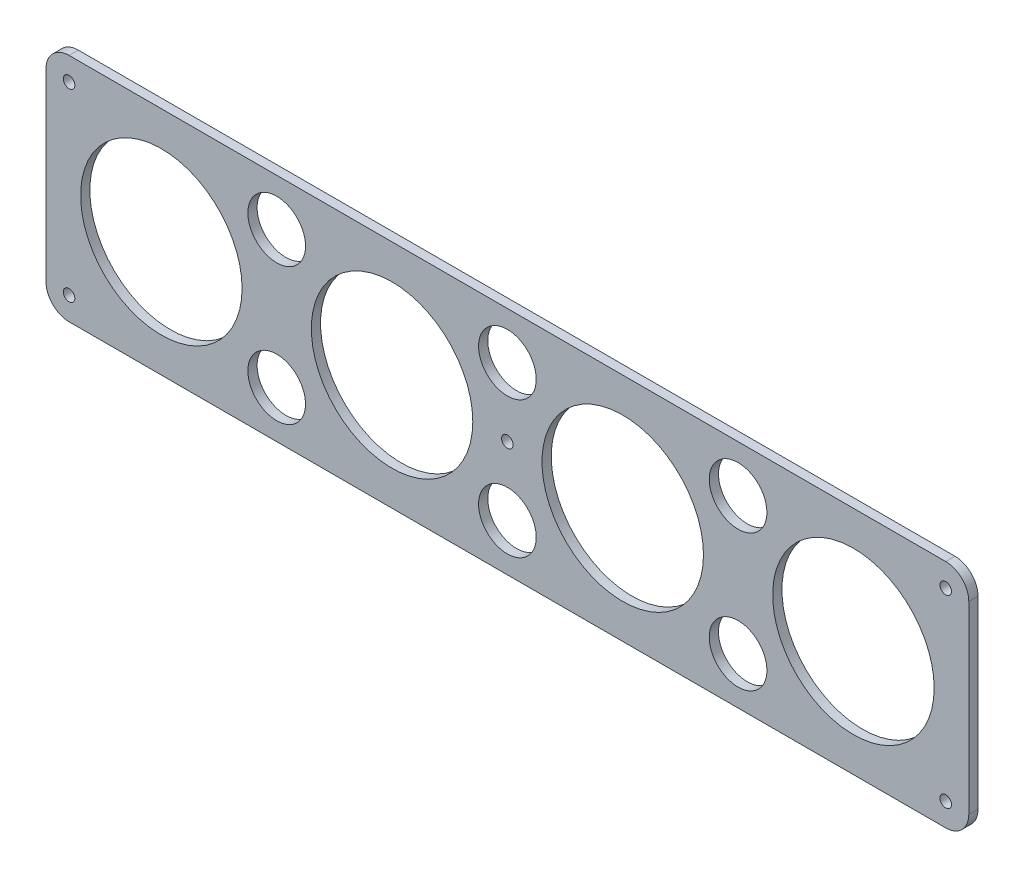
ISO-10303-21;
HEADER;
FILE_DESCRIPTION(('STEP AP214'),'2;1');
FILE_NAME('part.step','',(''),(''),'','','');
FILE_SCHEMA(('AUTOMOTIVE_DESIGN { 1 0 10303 214 1 1 1 1 }'));
ENDSEC;
DATA;
#1=APPLICATION_CONTEXT('core data for automotive mechanical design processes');
#2=APPLICATION_PROTOCOL_DEFINITION('international standard','automotive_design',2000,#1);
#3=PRODUCT_CONTEXT('',#1,'mechanical');
#4=PRODUCT('Part','Part','',(#3));
#5=PRODUCT_RELATED_PRODUCT_CATEGORY('part','',(#4));
#6=PRODUCT_DEFINITION_FORMATION('','',#4);
#7=PRODUCT_DEFINITION_CONTEXT('part definition',#1,'design');
#8=PRODUCT_DEFINITION('design','',#6,#7);
#9=PRODUCT_DEFINITION_SHAPE('','',#8);
#10=(LENGTH_UNIT() NAMED_UNIT(*) SI_UNIT(.MILLI.,.METRE.));
#11=(NAMED_UNIT(*) PLANE_ANGLE_UNIT() SI_UNIT($,.RADIAN.));
#12=(NAMED_UNIT(*) SI_UNIT($,.STERADIAN.) SOLID_ANGLE_UNIT());
#13=UNCERTAINTY_MEASURE_WITH_UNIT(LENGTH_MEASURE(1.E-05),#10,'distance_accuracy_value','');
#14=(GEOMETRIC_REPRESENTATION_CONTEXT(3) GLOBAL_UNCERTAINTY_ASSIGNED_CONTEXT((#13)) GLOBAL_UNIT_ASSIGNED_CONTEXT((#10,
#11,#12)) REPRESENTATION_CONTEXT('',''));
#15=CARTESIAN_POINT('',(0.,0.,0.));
#16=DIRECTION('',(0.,0.,1.));
#17=DIRECTION('',(1.,0.,0.));
#18=AXIS2_PLACEMENT_3D('',#15,#16,#17);
#19=CARTESIAN_POINT('',(0.,0.,4.));
#20=DIRECTION('',(0.,0.,-1.));
#21=DIRECTION('',(-1.,0.,0.));
#22=AXIS2_PLACEMENT_3D('',#19,#20,#21);
#23=PLANE('',#22);
#24=DIRECTION('',(0.,1.,0.));
#25=VECTOR('',#24,1.);
#26=CARTESIAN_POINT('',(400.,100.,4.));
#27=LINE('',#26,#25);
#28=CARTESIAN_POINT('',(400.,9.99999999999999,4.));
#29=VERTEX_POINT('',#28);
#30=CARTESIAN_POINT('',(400.,90.,4.));
#31=VERTEX_POINT('',#30);
#32=EDGE_CURVE('E171',#29,#31,#27,.T.);
#33=ORIENTED_EDGE('',*,*,#32,.T.);
#34=CARTESIAN_POINT('',(390.,90.,4.));
#35=DIRECTION('',(0.,0.,-1.));
#36=DIRECTION('',(-1.,0.,0.));
#37=AXIS2_PLACEMENT_3D('',#34,#35,#36);
#38=CIRCLE('',#37,10.);
#39=CARTESIAN_POINT('',(390.,100.,4.));
#40=VERTEX_POINT('',#39);
#41=EDGE_CURVE('E148',#31,#40,#38,.F.);
#42=ORIENTED_EDGE('',*,*,#41,.T.);
#43=DIRECTION('',(-1.,0.,0.));
#44=VECTOR('',#43,1.);
#45=CARTESIAN_POINT('',(0.,100.,4.));
#46=LINE('',#45,#44);
#47=CARTESIAN_POINT('',(10.,100.,4.));
#48=VERTEX_POINT('',#47);
#49=EDGE_CURVE('E119',#40,#48,#46,.T.);
#50=ORIENTED_EDGE('',*,*,#49,.T.);
#51=CARTESIAN_POINT('',(10.,90.,4.));
#52=DIRECTION('',(0.,0.,-1.));
#53=DIRECTION('',(-1.,0.,0.));
#54=AXIS2_PLACEMENT_3D('',#51,#52,#53);
#55=CIRCLE('',#54,10.);
#56=CARTESIAN_POINT('',(0.,90.,4.));
#57=VERTEX_POINT('',#56);
#58=EDGE_CURVE('E143',#48,#57,#55,.F.);
#59=ORIENTED_EDGE('',*,*,#58,.T.);
#60=DIRECTION('',(0.,-1.,0.));
#61=VECTOR('',#60,1.);
#62=CARTESIAN_POINT('',(0.,0.,4.));
#63=LINE('',#62,#61);
#64=CARTESIAN_POINT('',(0.,10.,4.));
#65=VERTEX_POINT('',#64);
#66=EDGE_CURVE('E126',#57,#65,#63,.T.);
#67=ORIENTED_EDGE('',*,*,#66,.T.);
#68=CARTESIAN_POINT('',(10.,10.,4.));
#69=DIRECTION('',(0.,0.,-1.));
#70=DIRECTION('',(-1.,0.,0.));
#71=AXIS2_PLACEMENT_3D('',#68,#69,#70);
#72=CIRCLE('',#71,10.);
#73=CARTESIAN_POINT('',(10.,0.,4.));
#74=VERTEX_POINT('',#73);
#75=EDGE_CURVE('E55',#65,#74,#72,.F.);
#76=ORIENTED_EDGE('',*,*,#75,.T.);
#77=DIRECTION('',(1.,0.,0.));
#78=VECTOR('',#77,1.);
#79=CARTESIAN_POINT('',(0.,0.,4.));
#80=LINE('',#79,#78);
#81=CARTESIAN_POINT('',(390.,0.,4.));
#82=VERTEX_POINT('',#81);
#83=EDGE_CURVE('E129',#74,#82,#80,.T.);
#84=ORIENTED_EDGE('',*,*,#83,.T.);
#85=CARTESIAN_POINT('',(390.,9.99999999999999,4.));
#86=DIRECTION('',(0.,0.,-1.));
#87=DIRECTION('',(-1.,0.,0.));
#88=AXIS2_PLACEMENT_3D('',#85,#86,#87);
#89=CIRCLE('',#88,10.);
#90=EDGE_CURVE('E146',#82,#29,#89,.F.);
#91=ORIENTED_EDGE('',*,*,#90,.T.);
#92=EDGE_LOOP('',(#33,#42,#50,#59,#67,#76,#84,#91));
#93=FACE_BOUND('',#92,.T.);
#94=CARTESIAN_POINT('',(50.,50.,4.));
#95=DIRECTION('',(0.,0.,1.));
#96=DIRECTION('',(1.,0.,0.));
#97=AXIS2_PLACEMENT_3D('',#94,#95,#96);
#98=CIRCLE('',#97,35.);
#99=CARTESIAN_POINT('',(85.,50.,4.));
#100=VERTEX_POINT('',#99);
#101=EDGE_CURVE('E164',#100,#100,#98,.T.);
#102=ORIENTED_EDGE('',*,*,#101,.F.);
#103=EDGE_LOOP('',(#102));
#104=FACE_BOUND('',#103,.T.);
#105=CARTESIAN_POINT('',(150.,50.,4.));
#106=DIRECTION('',(0.,0.,1.));
#107=DIRECTION('',(1.,0.,0.));
#108=AXIS2_PLACEMENT_3D('',#105,#106,#107);
#109=CIRCLE('',#108,35.);
#110=CARTESIAN_POINT('',(185.,50.,4.));
#111=VERTEX_POINT('',#110);
#112=EDGE_CURVE('E176',#111,#111,#109,.T.);
#113=ORIENTED_EDGE('',*,*,#112,.F.);
#114=EDGE_LOOP('',(#113));
#115=FACE_BOUND('',#114,.T.);
#116=CARTESIAN_POINT('',(250.,50.,4.));
#117=DIRECTION('',(0.,0.,1.));
#118=DIRECTION('',(1.,0.,0.));
#119=AXIS2_PLACEMENT_3D('',#116,#117,#118);
#120=CIRCLE('',#119,35.);
#121=CARTESIAN_POINT('',(285.,50.,4.));
#122=VERTEX_POINT('',#121);
#123=EDGE_CURVE('E181',#122,#122,#120,.T.);
#124=ORIENTED_EDGE('',*,*,#123,.F.);
#125=EDGE_LOOP('',(#124));
#126=FACE_BOUND('',#125,.T.);
#127=CARTESIAN_POINT('',(350.,50.,4.));
#128=DIRECTION('',(0.,0.,1.));
#129=DIRECTION('',(1.,0.,0.));
#130=AXIS2_PLACEMENT_3D('',#127,#128,#129);
#131=CIRCLE('',#130,35.);
#132=CARTESIAN_POINT('',(385.,50.,4.));
#133=VERTEX_POINT('',#132);
#134=EDGE_CURVE('E187',#133,#133,#131,.T.);
#135=ORIENTED_EDGE('',*,*,#134,.F.);
#136=EDGE_LOOP('',(#135));
#137=FACE_BOUND('',#136,.T.);
#138=CARTESIAN_POINT('',(100.,79.642297688561,4.));
#139=DIRECTION('',(0.,0.,1.));
#140=DIRECTION('',(1.,0.,0.));
#141=AXIS2_PLACEMENT_3D('',#138,#139,#140);
#142=CIRCLE('',#141,12.5);
#143=CARTESIAN_POINT('',(112.5,79.642297688561,4.));
#144=VERTEX_POINT('',#143);
#145=EDGE_CURVE('E193',#144,#144,#142,.T.);
#146=ORIENTED_EDGE('',*,*,#145,.F.);
#147=EDGE_LOOP('',(#146));
#148=FACE_BOUND('',#147,.T.);
#149=CARTESIAN_POINT('',(100.,20.357702311439,4.));
#150=DIRECTION('',(0.,0.,1.));
#151=DIRECTION('',(-1.,0.,0.));
#152=AXIS2_PLACEMENT_3D('',#149,#150,#151);
#153=CIRCLE('',#152,12.5);
#154=CARTESIAN_POINT('',(87.5,20.357702311439,4.));
#155=VERTEX_POINT('',#154);
#156=EDGE_CURVE('E199',#155,#155,#153,.T.);
#157=ORIENTED_EDGE('',*,*,#156,.F.);
#158=EDGE_LOOP('',(#157));
#159=FACE_BOUND('',#158,.T.);
#160=CARTESIAN_POINT('',(200.,79.642297688561,4.));
#161=DIRECTION('',(0.,0.,1.));
#162=DIRECTION('',(1.,0.,0.));
#163=AXIS2_PLACEMENT_3D('',#160,#161,#162);
#164=CIRCLE('',#163,12.5);
#165=CARTESIAN_POINT('',(212.5,79.642297688561,4.));
#166=VERTEX_POINT('',#165);
#167=EDGE_CURVE('E205',#166,#166,#164,.T.);
#168=ORIENTED_EDGE('',*,*,#167,.F.);
#169=EDGE_LOOP('',(#168));
#170=FACE_BOUND('',#169,.T.);
#171=CARTESIAN_POINT('',(200.,20.357702311439,4.));
#172=DIRECTION('',(0.,0.,1.));
#173=DIRECTION('',(-1.,0.,0.));
#174=AXIS2_PLACEMENT_3D('',#171,#172,#173);
#175=CIRCLE('',#174,12.5);
#176=CARTESIAN_POINT('',(187.5,20.357702311439,4.));
#177=VERTEX_POINT('',#176);
#178=EDGE_CURVE('E211',#177,#177,#175,.T.);
#179=ORIENTED_EDGE('',*,*,#178,.F.);
#180=EDGE_LOOP('',(#179));
#181=FACE_BOUND('',#180,.T.);
#182=CARTESIAN_POINT('',(300.,79.642297688561,4.));
#183=DIRECTION('',(0.,0.,1.));
#184=DIRECTION('',(1.,0.,0.));
#185=AXIS2_PLACEMENT_3D('',#182,#183,#184);
#186=CIRCLE('',#185,12.5);
#187=CARTESIAN_POINT('',(312.5,79.642297688561,4.));
#188=VERTEX_POINT('',#187);
#189=EDGE_CURVE('E217',#188,#188,#186,.T.);
#190=ORIENTED_EDGE('',*,*,#189,.F.);
#191=EDGE_LOOP('',(#190));
#192=FACE_BOUND('',#191,.T.);
#193=CARTESIAN_POINT('',(300.,20.357702311439,4.));
#194=DIRECTION('',(0.,0.,1.));
#195=DIRECTION('',(-1.,0.,0.));
#196=AXIS2_PLACEMENT_3D('',#193,#194,#195);
#197=CIRCLE('',#196,12.5);
#198=CARTESIAN_POINT('',(287.5,20.357702311439,4.));
#199=VERTEX_POINT('',#198);
#200=EDGE_CURVE('E223',#199,#199,#197,.T.);
#201=ORIENTED_EDGE('',*,*,#200,.F.);
#202=EDGE_LOOP('',(#201));
#203=FACE_BOUND('',#202,.T.);
#204=CARTESIAN_POINT('',(10.,10.,4.));
#205=DIRECTION('',(0.,0.,1.));
#206=DIRECTION('',(1.,0.,0.));
#207=AXIS2_PLACEMENT_3D('',#204,#205,#206);
#208=CIRCLE('',#207,2.5);
#209=CARTESIAN_POINT('',(12.5,10.,4.));
#210=VERTEX_POINT('',#209);
#211=EDGE_CURVE('E229',#210,#210,#208,.T.);
#212=ORIENTED_EDGE('',*,*,#211,.F.);
#213=EDGE_LOOP('',(#212));
#214=FACE_BOUND('',#213,.T.);
#215=CARTESIAN_POINT('',(10.,90.,4.));
#216=DIRECTION('',(0.,0.,1.));
#217=DIRECTION('',(-1.,0.,0.));
#218=AXIS2_PLACEMENT_3D('',#215,#216,#217);
#219=CIRCLE('',#218,2.5);
#220=CARTESIAN_POINT('',(7.50000000000001,90.,4.));
#221=VERTEX_POINT('',#220);
#222=EDGE_CURVE('E235',#221,#221,#219,.T.);
#223=ORIENTED_EDGE('',*,*,#222,.F.);
#224=EDGE_LOOP('',(#223));
#225=FACE_BOUND('',#224,.T.);
#226=CARTESIAN_POINT('',(390.,90.,4.));
#227=DIRECTION('',(0.,0.,1.));
#228=DIRECTION('',(1.,0.,0.));
#229=AXIS2_PLACEMENT_3D('',#226,#227,#228);
#230=CIRCLE('',#229,2.50000000000002);
#231=CARTESIAN_POINT('',(392.5,90.,4.));
#232=VERTEX_POINT('',#231);
#233=EDGE_CURVE('E241',#232,#232,#230,.T.);
#234=ORIENTED_EDGE('',*,*,#233,.F.);
#235=EDGE_LOOP('',(#234));
#236=FACE_BOUND('',#235,.T.);
#237=CARTESIAN_POINT('',(390.,10.,4.));
#238=DIRECTION('',(0.,0.,1.));
#239=DIRECTION('',(-1.,0.,0.));
#240=AXIS2_PLACEMENT_3D('',#237,#238,#239);
#241=CIRCLE('',#240,2.50000000000002);
#242=CARTESIAN_POINT('',(387.5,10.,4.));
#243=VERTEX_POINT('',#242);
#244=EDGE_CURVE('E247',#243,#243,#241,.T.);
#245=ORIENTED_EDGE('',*,*,#244,.F.);
#246=EDGE_LOOP('',(#245));
#247=FACE_BOUND('',#246,.T.);
#248=CARTESIAN_POINT('',(200.,50.,4.));
#249=DIRECTION('',(0.,0.,1.));
#250=DIRECTION('',(1.,0.,0.));
#251=AXIS2_PLACEMENT_3D('',#248,#249,#250);
#252=CIRCLE('',#251,2.5);
#253=CARTESIAN_POINT('',(202.5,50.,4.));
#254=VERTEX_POINT('',#253);
#255=EDGE_CURVE('E253',#254,#254,#252,.T.);
#256=ORIENTED_EDGE('',*,*,#255,.F.);
#257=EDGE_LOOP('',(#256));
#258=FACE_BOUND('',#257,.T.);
#259=ADVANCED_FACE('F33',(#93,#104,#115,#126,#137,#148,#159,#170,#181,#192,#203,#214,#225,#236,
#247,#258),#23,.F.);
#260=CARTESIAN_POINT('',(0.,0.,0.));
#261=DIRECTION('',(0.,0.,-1.));
#262=DIRECTION('',(-1.,0.,0.));
#263=AXIS2_PLACEMENT_3D('',#260,#261,#262);
#264=PLANE('',#263);
#265=CARTESIAN_POINT('',(390.,10.,0.));
#266=DIRECTION('',(0.,0.,1.));
#267=DIRECTION('',(-1.,0.,0.));
#268=AXIS2_PLACEMENT_3D('',#265,#266,#267);
#269=CIRCLE('',#268,2.50000000000002);
#270=CARTESIAN_POINT('',(387.5,10.,0.));
#271=VERTEX_POINT('',#270);
#272=EDGE_CURVE('E250',#271,#271,#269,.T.);
#273=ORIENTED_EDGE('',*,*,#272,.T.);
#274=EDGE_LOOP('',(#273));
#275=FACE_BOUND('',#274,.T.);
#276=CARTESIAN_POINT('',(10.,90.,0.));
#277=DIRECTION('',(0.,0.,1.));
#278=DIRECTION('',(-1.,0.,0.));
#279=AXIS2_PLACEMENT_3D('',#276,#277,#278);
#280=CIRCLE('',#279,2.5);
#281=CARTESIAN_POINT('',(7.50000000000001,90.,0.));
#282=VERTEX_POINT('',#281);
#283=EDGE_CURVE('E238',#282,#282,#280,.T.);
#284=ORIENTED_EDGE('',*,*,#283,.T.);
#285=EDGE_LOOP('',(#284));
#286=FACE_BOUND('',#285,.T.);
#287=CARTESIAN_POINT('',(300.,20.357702311439,0.));
#288=DIRECTION('',(0.,0.,1.));
#289=DIRECTION('',(-1.,0.,0.));
#290=AXIS2_PLACEMENT_3D('',#287,#288,#289);
#291=CIRCLE('',#290,12.5);
#292=CARTESIAN_POINT('',(287.5,20.357702311439,0.));
#293=VERTEX_POINT('',#292);
#294=EDGE_CURVE('E226',#293,#293,#291,.T.);
#295=ORIENTED_EDGE('',*,*,#294,.T.);
#296=EDGE_LOOP('',(#295));
#297=FACE_BOUND('',#296,.T.);
#298=CARTESIAN_POINT('',(200.,20.357702311439,0.));
#299=DIRECTION('',(0.,0.,1.));
#300=DIRECTION('',(-1.,0.,0.));
#301=AXIS2_PLACEMENT_3D('',#298,#299,#300);
#302=CIRCLE('',#301,12.5);
#303=CARTESIAN_POINT('',(187.5,20.357702311439,0.));
#304=VERTEX_POINT('',#303);
#305=EDGE_CURVE('E214',#304,#304,#302,.T.);
#306=ORIENTED_EDGE('',*,*,#305,.T.);
#307=EDGE_LOOP('',(#306));
#308=FACE_BOUND('',#307,.T.);
#309=CARTESIAN_POINT('',(100.,20.357702311439,0.));
#310=DIRECTION('',(0.,0.,1.));
#311=DIRECTION('',(-1.,0.,0.));
#312=AXIS2_PLACEMENT_3D('',#309,#310,#311);
#313=CIRCLE('',#312,12.5);
#314=CARTESIAN_POINT('',(87.5,20.357702311439,0.));
#315=VERTEX_POINT('',#314);
#316=EDGE_CURVE('E202',#315,#315,#313,.T.);
#317=ORIENTED_EDGE('',*,*,#316,.T.);
#318=EDGE_LOOP('',(#317));
#319=FACE_BOUND('',#318,.T.);
#320=CARTESIAN_POINT('',(350.,50.,0.));
#321=DIRECTION('',(0.,0.,1.));
#322=DIRECTION('',(1.,0.,0.));
#323=AXIS2_PLACEMENT_3D('',#320,#321,#322);
#324=CIRCLE('',#323,35.);
#325=CARTESIAN_POINT('',(385.,50.,0.));
#326=VERTEX_POINT('',#325);
#327=EDGE_CURVE('E190',#326,#326,#324,.T.);
#328=ORIENTED_EDGE('',*,*,#327,.T.);
#329=EDGE_LOOP('',(#328));
#330=FACE_BOUND('',#329,.T.);
#331=CARTESIAN_POINT('',(150.,50.,0.));
#332=DIRECTION('',(0.,0.,1.));
#333=DIRECTION('',(1.,0.,0.));
#334=AXIS2_PLACEMENT_3D('',#331,#332,#333);
#335=CIRCLE('',#334,35.);
#336=CARTESIAN_POINT('',(185.,50.,0.));
#337=VERTEX_POINT('',#336);
#338=EDGE_CURVE('E178',#337,#337,#335,.T.);
#339=ORIENTED_EDGE('',*,*,#338,.T.);
#340=EDGE_LOOP('',(#339));
#341=FACE_BOUND('',#340,.T.);
#342=DIRECTION('',(-1.,0.,0.));
#343=VECTOR('',#342,1.);
#344=CARTESIAN_POINT('',(0.,100.,0.));
#345=LINE('',#344,#343);
#346=CARTESIAN_POINT('',(390.,100.,0.));
#347=VERTEX_POINT('',#346);
#348=CARTESIAN_POINT('',(10.,100.,0.));
#349=VERTEX_POINT('',#348);
#350=EDGE_CURVE('E116',#347,#349,#345,.T.);
#351=ORIENTED_EDGE('',*,*,#350,.F.);
#352=CARTESIAN_POINT('',(390.,90.,0.));
#353=DIRECTION('',(0.,0.,-1.));
#354=DIRECTION('',(-1.,0.,0.));
#355=AXIS2_PLACEMENT_3D('',#352,#353,#354);
#356=CIRCLE('',#355,10.);
#357=CARTESIAN_POINT('',(400.,90.,0.));
#358=VERTEX_POINT('',#357);
#359=EDGE_CURVE('E99',#347,#358,#356,.T.);
#360=ORIENTED_EDGE('',*,*,#359,.T.);
#361=DIRECTION('',(0.,1.,0.));
#362=VECTOR('',#361,1.);
#363=CARTESIAN_POINT('',(400.,100.,0.));
#364=LINE('',#363,#362);
#365=CARTESIAN_POINT('',(400.,9.99999999999999,0.));
#366=VERTEX_POINT('',#365);
#367=EDGE_CURVE('E127',#366,#358,#364,.T.);
#368=ORIENTED_EDGE('',*,*,#367,.F.);
#369=CARTESIAN_POINT('',(390.,9.99999999999999,0.));
#370=DIRECTION('',(0.,0.,-1.));
#371=DIRECTION('',(-1.,0.,0.));
#372=AXIS2_PLACEMENT_3D('',#369,#370,#371);
#373=CIRCLE('',#372,10.);
#374=CARTESIAN_POINT('',(390.,0.,0.));
#375=VERTEX_POINT('',#374);
#376=EDGE_CURVE('E110',#366,#375,#373,.T.);
#377=ORIENTED_EDGE('',*,*,#376,.T.);
#378=DIRECTION('',(1.,0.,0.));
#379=VECTOR('',#378,1.);
#380=CARTESIAN_POINT('',(0.,0.,0.));
#381=LINE('',#380,#379);
#382=CARTESIAN_POINT('',(10.,0.,0.));
#383=VERTEX_POINT('',#382);
#384=EDGE_CURVE('E131',#383,#375,#381,.T.);
#385=ORIENTED_EDGE('',*,*,#384,.F.);
#386=CARTESIAN_POINT('',(10.,10.,0.));
#387=DIRECTION('',(0.,0.,-1.));
#388=DIRECTION('',(-1.,0.,0.));
#389=AXIS2_PLACEMENT_3D('',#386,#387,#388);
#390=CIRCLE('',#389,10.);
#391=CARTESIAN_POINT('',(0.,10.,0.));
#392=VERTEX_POINT('',#391);
#393=EDGE_CURVE('E137',#383,#392,#390,.T.);
#394=ORIENTED_EDGE('',*,*,#393,.T.);
#395=DIRECTION('',(0.,-1.,0.));
#396=VECTOR('',#395,1.);
#397=CARTESIAN_POINT('',(0.,0.,0.));
#398=LINE('',#397,#396);
#399=CARTESIAN_POINT('',(0.,90.,0.));
#400=VERTEX_POINT('',#399);
#401=EDGE_CURVE('E159',#400,#392,#398,.T.);
#402=ORIENTED_EDGE('',*,*,#401,.F.);
#403=CARTESIAN_POINT('',(10.,90.,0.));
#404=DIRECTION('',(0.,0.,-1.));
#405=DIRECTION('',(-1.,0.,0.));
#406=AXIS2_PLACEMENT_3D('',#403,#404,#405);
#407=CIRCLE('',#406,10.);
#408=EDGE_CURVE('E120',#400,#349,#407,.T.);
#409=ORIENTED_EDGE('',*,*,#408,.T.);
#410=EDGE_LOOP('',(#351,#360,#368,#377,#385,#394,#402,#409));
#411=FACE_BOUND('',#410,.T.);
#412=CARTESIAN_POINT('',(50.,50.,0.));
#413=DIRECTION('',(0.,0.,1.));
#414=DIRECTION('',(1.,0.,0.));
#415=AXIS2_PLACEMENT_3D('',#412,#413,#414);
#416=CIRCLE('',#415,35.);
#417=CARTESIAN_POINT('',(85.,50.,0.));
#418=VERTEX_POINT('',#417);
#419=EDGE_CURVE('E167',#418,#418,#416,.T.);
#420=ORIENTED_EDGE('',*,*,#419,.T.);
#421=EDGE_LOOP('',(#420));
#422=FACE_BOUND('',#421,.T.);
#423=CARTESIAN_POINT('',(250.,50.,0.));
#424=DIRECTION('',(0.,0.,1.));
#425=DIRECTION('',(1.,0.,0.));
#426=AXIS2_PLACEMENT_3D('',#423,#424,#425);
#427=CIRCLE('',#426,35.);
#428=CARTESIAN_POINT('',(285.,50.,0.));
#429=VERTEX_POINT('',#428);
#430=EDGE_CURVE('E184',#429,#429,#427,.T.);
#431=ORIENTED_EDGE('',*,*,#430,.T.);
#432=EDGE_LOOP('',(#431));
#433=FACE_BOUND('',#432,.T.);
#434=CARTESIAN_POINT('',(100.,79.642297688561,0.));
#435=DIRECTION('',(0.,0.,1.));
#436=DIRECTION('',(1.,0.,0.));
#437=AXIS2_PLACEMENT_3D('',#434,#435,#436);
#438=CIRCLE('',#437,12.5);
#439=CARTESIAN_POINT('',(112.5,79.642297688561,0.));
#440=VERTEX_POINT('',#439);
#441=EDGE_CURVE('E196',#440,#440,#438,.T.);
#442=ORIENTED_EDGE('',*,*,#441,.T.);
#443=EDGE_LOOP('',(#442));
#444=FACE_BOUND('',#443,.T.);
#445=CARTESIAN_POINT('',(200.,79.642297688561,0.));
#446=DIRECTION('',(0.,0.,1.));
#447=DIRECTION('',(1.,0.,0.));
#448=AXIS2_PLACEMENT_3D('',#445,#446,#447);
#449=CIRCLE('',#448,12.5);
#450=CARTESIAN_POINT('',(212.5,79.642297688561,0.));
#451=VERTEX_POINT('',#450);
#452=EDGE_CURVE('E208',#451,#451,#449,.T.);
#453=ORIENTED_EDGE('',*,*,#452,.T.);
#454=EDGE_LOOP('',(#453));
#455=FACE_BOUND('',#454,.T.);
#456=CARTESIAN_POINT('',(300.,79.642297688561,0.));
#457=DIRECTION('',(0.,0.,1.));
#458=DIRECTION('',(1.,0.,0.));
#459=AXIS2_PLACEMENT_3D('',#456,#457,#458);
#460=CIRCLE('',#459,12.5);
#461=CARTESIAN_POINT('',(312.5,79.642297688561,0.));
#462=VERTEX_POINT('',#461);
#463=EDGE_CURVE('E220',#462,#462,#460,.T.);
#464=ORIENTED_EDGE('',*,*,#463,.T.);
#465=EDGE_LOOP('',(#464));
#466=FACE_BOUND('',#465,.T.);
#467=CARTESIAN_POINT('',(10.,10.,0.));
#468=DIRECTION('',(0.,0.,1.));
#469=DIRECTION('',(1.,0.,0.));
#470=AXIS2_PLACEMENT_3D('',#467,#468,#469);
#471=CIRCLE('',#470,2.5);
#472=CARTESIAN_POINT('',(12.5,10.,0.));
#473=VERTEX_POINT('',#472);
#474=EDGE_CURVE('E232',#473,#473,#471,.T.);
#475=ORIENTED_EDGE('',*,*,#474,.T.);
#476=EDGE_LOOP('',(#475));
#477=FACE_BOUND('',#476,.T.);
#478=CARTESIAN_POINT('',(390.,90.,0.));
#479=DIRECTION('',(0.,0.,1.));
#480=DIRECTION('',(1.,0.,0.));
#481=AXIS2_PLACEMENT_3D('',#478,#479,#480);
#482=CIRCLE('',#481,2.50000000000002);
#483=CARTESIAN_POINT('',(392.5,90.,0.));
#484=VERTEX_POINT('',#483);
#485=EDGE_CURVE('E244',#484,#484,#482,.T.);
#486=ORIENTED_EDGE('',*,*,#485,.T.);
#487=EDGE_LOOP('',(#486));
#488=FACE_BOUND('',#487,.T.);
#489=CARTESIAN_POINT('',(200.,50.,0.));
#490=DIRECTION('',(0.,0.,1.));
#491=DIRECTION('',(1.,0.,0.));
#492=AXIS2_PLACEMENT_3D('',#489,#490,#491);
#493=CIRCLE('',#492,2.5);
#494=CARTESIAN_POINT('',(202.5,50.,0.));
#495=VERTEX_POINT('',#494);
#496=EDGE_CURVE('E256',#495,#495,#493,.T.);
#497=ORIENTED_EDGE('',*,*,#496,.T.);
#498=EDGE_LOOP('',(#497));
#499=FACE_BOUND('',#498,.T.);
#500=ADVANCED_FACE('F123',(#275,#286,#297,#308,#319,#330,#341,#411,#422,#433,#444,#455,#466,
#477,#488,#499),#264,.T.);
#501=CARTESIAN_POINT('',(0.,0.,4.));
#502=DIRECTION('',(1.,0.,0.));
#503=DIRECTION('',(0.,0.,-1.));
#504=AXIS2_PLACEMENT_3D('',#501,#502,#503);
#505=PLANE('',#504);
#506=ORIENTED_EDGE('',*,*,#401,.T.);
#507=DIRECTION('',(0.,0.,-1.));
#508=VECTOR('',#507,1.);
#509=CARTESIAN_POINT('',(0.,10.,4.));
#510=LINE('',#509,#508);
#511=EDGE_CURVE('E11',#392,#65,#510,.F.);
#512=ORIENTED_EDGE('',*,*,#511,.T.);
#513=ORIENTED_EDGE('',*,*,#66,.F.);
#514=DIRECTION('',(0.,0.,-1.));
#515=VECTOR('',#514,1.);
#516=CARTESIAN_POINT('',(0.,90.,4.));
#517=LINE('',#516,#515);
#518=EDGE_CURVE('E41',#57,#400,#517,.T.);
#519=ORIENTED_EDGE('',*,*,#518,.T.);
#520=EDGE_LOOP('',(#506,#512,#513,#519));
#521=FACE_BOUND('',#520,.T.);
#522=ADVANCED_FACE('F158',(#521),#505,.F.);
#523=CARTESIAN_POINT('',(0.,0.,4.));
#524=DIRECTION('',(0.,1.,0.));
#525=DIRECTION('',(0.,0.,1.));
#526=AXIS2_PLACEMENT_3D('',#523,#524,#525);
#527=PLANE('',#526);
#528=ORIENTED_EDGE('',*,*,#384,.T.);
#529=DIRECTION('',(0.,0.,-1.));
#530=VECTOR('',#529,1.);
#531=CARTESIAN_POINT('',(390.,0.,4.));
#532=LINE('',#531,#530);
#533=EDGE_CURVE('E48',#375,#82,#532,.F.);
#534=ORIENTED_EDGE('',*,*,#533,.T.);
#535=ORIENTED_EDGE('',*,*,#83,.F.);
#536=DIRECTION('',(0.,0.,-1.));
#537=VECTOR('',#536,1.);
#538=CARTESIAN_POINT('',(10.,0.,4.));
#539=LINE('',#538,#537);
#540=EDGE_CURVE('E150',#74,#383,#539,.T.);
#541=ORIENTED_EDGE('',*,*,#540,.T.);
#542=EDGE_LOOP('',(#528,#534,#535,#541));
#543=FACE_BOUND('',#542,.T.);
#544=ADVANCED_FACE('F282',(#543),#527,.F.);
#545=CARTESIAN_POINT('',(400.,100.,4.));
#546=DIRECTION('',(-1.,0.,0.));
#547=DIRECTION('',(0.,0.,1.));
#548=AXIS2_PLACEMENT_3D('',#545,#546,#547);
#549=PLANE('',#548);
#550=ORIENTED_EDGE('',*,*,#367,.T.);
#551=DIRECTION('',(0.,0.,-1.));
#552=VECTOR('',#551,1.);
#553=CARTESIAN_POINT('',(400.,90.,4.));
#554=LINE('',#553,#552);
#555=EDGE_CURVE('E104',#358,#31,#554,.F.);
#556=ORIENTED_EDGE('',*,*,#555,.T.);
#557=ORIENTED_EDGE('',*,*,#32,.F.);
#558=DIRECTION('',(0.,0.,-1.));
#559=VECTOR('',#558,1.);
#560=CARTESIAN_POINT('',(400.,9.99999999999999,4.));
#561=LINE('',#560,#559);
#562=EDGE_CURVE('E109',#29,#366,#561,.T.);
#563=ORIENTED_EDGE('',*,*,#562,.T.);
#564=EDGE_LOOP('',(#550,#556,#557,#563));
#565=FACE_BOUND('',#564,.T.);
#566=ADVANCED_FACE('F279',(#565),#549,.F.);
#567=CARTESIAN_POINT('',(0.,100.,4.));
#568=DIRECTION('',(0.,-1.,0.));
#569=DIRECTION('',(0.,0.,-1.));
#570=AXIS2_PLACEMENT_3D('',#567,#568,#569);
#571=PLANE('',#570);
#572=ORIENTED_EDGE('',*,*,#49,.F.);
#573=DIRECTION('',(0.,0.,-1.));
#574=VECTOR('',#573,1.);
#575=CARTESIAN_POINT('',(390.,100.,4.));
#576=LINE('',#575,#574);
#577=EDGE_CURVE('E103',#40,#347,#576,.T.);
#578=ORIENTED_EDGE('',*,*,#577,.T.);
#579=ORIENTED_EDGE('',*,*,#350,.T.);
#580=DIRECTION('',(0.,0.,-1.));
#581=VECTOR('',#580,1.);
#582=CARTESIAN_POINT('',(10.,100.,4.));
#583=LINE('',#582,#581);
#584=EDGE_CURVE('E121',#349,#48,#583,.F.);
#585=ORIENTED_EDGE('',*,*,#584,.T.);
#586=EDGE_LOOP('',(#572,#578,#579,#585));
#587=FACE_BOUND('',#586,.T.);
#588=ADVANCED_FACE('F115',(#587),#571,.F.);
#589=CARTESIAN_POINT('',(50.,50.,4.));
#590=DIRECTION('',(0.,0.,-1.));
#591=DIRECTION('',(-1.,0.,0.));
#592=AXIS2_PLACEMENT_3D('',#589,#590,#591);
#593=CYLINDRICAL_SURFACE('',#592,35.);
#594=ORIENTED_EDGE('',*,*,#101,.T.);
#595=EDGE_LOOP('',(#594));
#596=FACE_BOUND('',#595,.T.);
#597=ORIENTED_EDGE('',*,*,#419,.F.);
#598=EDGE_LOOP('',(#597));
#599=FACE_BOUND('',#598,.T.);
#600=ADVANCED_FACE('F274',(#596,#599),#593,.F.);
#601=CARTESIAN_POINT('',(150.,50.,4.));
#602=DIRECTION('',(0.,0.,-1.));
#603=DIRECTION('',(-1.,0.,0.));
#604=AXIS2_PLACEMENT_3D('',#601,#602,#603);
#605=CYLINDRICAL_SURFACE('',#604,35.);
#606=ORIENTED_EDGE('',*,*,#112,.T.);
#607=EDGE_LOOP('',(#606));
#608=FACE_BOUND('',#607,.T.);
#609=ORIENTED_EDGE('',*,*,#338,.F.);
#610=EDGE_LOOP('',(#609));
#611=FACE_BOUND('',#610,.T.);
#612=ADVANCED_FACE('F485',(#608,#611),#605,.F.);
#613=CARTESIAN_POINT('',(250.,50.,4.));
#614=DIRECTION('',(0.,0.,-1.));
#615=DIRECTION('',(-1.,0.,0.));
#616=AXIS2_PLACEMENT_3D('',#613,#614,#615);
#617=CYLINDRICAL_SURFACE('',#616,35.);
#618=ORIENTED_EDGE('',*,*,#123,.T.);
#619=EDGE_LOOP('',(#618));
#620=FACE_BOUND('',#619,.T.);
#621=ORIENTED_EDGE('',*,*,#430,.F.);
#622=EDGE_LOOP('',(#621));
#623=FACE_BOUND('',#622,.T.);
#624=ADVANCED_FACE('F475',(#620,#623),#617,.F.);
#625=CARTESIAN_POINT('',(350.,50.,4.));
#626=DIRECTION('',(0.,0.,-1.));
#627=DIRECTION('',(-1.,0.,0.));
#628=AXIS2_PLACEMENT_3D('',#625,#626,#627);
#629=CYLINDRICAL_SURFACE('',#628,35.);
#630=ORIENTED_EDGE('',*,*,#134,.T.);
#631=EDGE_LOOP('',(#630));
#632=FACE_BOUND('',#631,.T.);
#633=ORIENTED_EDGE('',*,*,#327,.F.);
#634=EDGE_LOOP('',(#633));
#635=FACE_BOUND('',#634,.T.);
#636=ADVANCED_FACE('F465',(#632,#635),#629,.F.);
#637=CARTESIAN_POINT('',(100.,79.642297688561,4.));
#638=DIRECTION('',(0.,0.,-1.));
#639=DIRECTION('',(-1.,0.,0.));
#640=AXIS2_PLACEMENT_3D('',#637,#638,#639);
#641=CYLINDRICAL_SURFACE('',#640,12.5);
#642=ORIENTED_EDGE('',*,*,#145,.T.);
#643=EDGE_LOOP('',(#642));
#644=FACE_BOUND('',#643,.T.);
#645=ORIENTED_EDGE('',*,*,#441,.F.);
#646=EDGE_LOOP('',(#645));
#647=FACE_BOUND('',#646,.T.);
#648=ADVANCED_FACE('F455',(#644,#647),#641,.F.);
#649=CARTESIAN_POINT('',(100.,20.357702311439,4.));
#650=DIRECTION('',(0.,0.,-1.));
#651=DIRECTION('',(-1.,0.,0.));
#652=AXIS2_PLACEMENT_3D('',#649,#650,#651);
#653=CYLINDRICAL_SURFACE('',#652,12.5);
#654=ORIENTED_EDGE('',*,*,#156,.T.);
#655=EDGE_LOOP('',(#654));
#656=FACE_BOUND('',#655,.T.);
#657=ORIENTED_EDGE('',*,*,#316,.F.);
#658=EDGE_LOOP('',(#657));
#659=FACE_BOUND('',#658,.T.);
#660=ADVANCED_FACE('F445',(#656,#659),#653,.F.);
#661=CARTESIAN_POINT('',(200.,79.642297688561,4.));
#662=DIRECTION('',(0.,0.,-1.));
#663=DIRECTION('',(-1.,0.,0.));
#664=AXIS2_PLACEMENT_3D('',#661,#662,#663);
#665=CYLINDRICAL_SURFACE('',#664,12.5);
#666=ORIENTED_EDGE('',*,*,#167,.T.);
#667=EDGE_LOOP('',(#666));
#668=FACE_BOUND('',#667,.T.);
#669=ORIENTED_EDGE('',*,*,#452,.F.);
#670=EDGE_LOOP('',(#669));
#671=FACE_BOUND('',#670,.T.);
#672=ADVANCED_FACE('F435',(#668,#671),#665,.F.);
#673=CARTESIAN_POINT('',(200.,20.357702311439,4.));
#674=DIRECTION('',(0.,0.,-1.));
#675=DIRECTION('',(-1.,0.,0.));
#676=AXIS2_PLACEMENT_3D('',#673,#674,#675);
#677=CYLINDRICAL_SURFACE('',#676,12.5);
#678=ORIENTED_EDGE('',*,*,#178,.T.);
#679=EDGE_LOOP('',(#678));
#680=FACE_BOUND('',#679,.T.);
#681=ORIENTED_EDGE('',*,*,#305,.F.);
#682=EDGE_LOOP('',(#681));
#683=FACE_BOUND('',#682,.T.);
#684=ADVANCED_FACE('F425',(#680,#683),#677,.F.);
#685=CARTESIAN_POINT('',(300.,79.642297688561,4.));
#686=DIRECTION('',(0.,0.,-1.));
#687=DIRECTION('',(-1.,0.,0.));
#688=AXIS2_PLACEMENT_3D('',#685,#686,#687);
#689=CYLINDRICAL_SURFACE('',#688,12.5);
#690=ORIENTED_EDGE('',*,*,#189,.T.);
#691=EDGE_LOOP('',(#690));
#692=FACE_BOUND('',#691,.T.);
#693=ORIENTED_EDGE('',*,*,#463,.F.);
#694=EDGE_LOOP('',(#693));
#695=FACE_BOUND('',#694,.T.);
#696=ADVANCED_FACE('F415',(#692,#695),#689,.F.);
#697=CARTESIAN_POINT('',(300.,20.357702311439,4.));
#698=DIRECTION('',(0.,0.,-1.));
#699=DIRECTION('',(-1.,0.,0.));
#700=AXIS2_PLACEMENT_3D('',#697,#698,#699);
#701=CYLINDRICAL_SURFACE('',#700,12.5);
#702=ORIENTED_EDGE('',*,*,#200,.T.);
#703=EDGE_LOOP('',(#702));
#704=FACE_BOUND('',#703,.T.);
#705=ORIENTED_EDGE('',*,*,#294,.F.);
#706=EDGE_LOOP('',(#705));
#707=FACE_BOUND('',#706,.T.);
#708=ADVANCED_FACE('F405',(#704,#707),#701,.F.);
#709=CARTESIAN_POINT('',(10.,10.,4.));
#710=DIRECTION('',(0.,0.,-1.));
#711=DIRECTION('',(-1.,0.,0.));
#712=AXIS2_PLACEMENT_3D('',#709,#710,#711);
#713=CYLINDRICAL_SURFACE('',#712,2.5);
#714=ORIENTED_EDGE('',*,*,#211,.T.);
#715=EDGE_LOOP('',(#714));
#716=FACE_BOUND('',#715,.T.);
#717=ORIENTED_EDGE('',*,*,#474,.F.);
#718=EDGE_LOOP('',(#717));
#719=FACE_BOUND('',#718,.T.);
#720=ADVANCED_FACE('F395',(#716,#719),#713,.F.);
#721=CARTESIAN_POINT('',(10.,90.,4.));
#722=DIRECTION('',(0.,0.,-1.));
#723=DIRECTION('',(-1.,0.,0.));
#724=AXIS2_PLACEMENT_3D('',#721,#722,#723);
#725=CYLINDRICAL_SURFACE('',#724,2.5);
#726=ORIENTED_EDGE('',*,*,#222,.T.);
#727=EDGE_LOOP('',(#726));
#728=FACE_BOUND('',#727,.T.);
#729=ORIENTED_EDGE('',*,*,#283,.F.);
#730=EDGE_LOOP('',(#729));
#731=FACE_BOUND('',#730,.T.);
#732=ADVANCED_FACE('F385',(#728,#731),#725,.F.);
#733=CARTESIAN_POINT('',(390.,90.,4.));
#734=DIRECTION('',(0.,0.,-1.));
#735=DIRECTION('',(-1.,0.,0.));
#736=AXIS2_PLACEMENT_3D('',#733,#734,#735);
#737=CYLINDRICAL_SURFACE('',#736,2.50000000000002);
#738=ORIENTED_EDGE('',*,*,#233,.T.);
#739=EDGE_LOOP('',(#738));
#740=FACE_BOUND('',#739,.T.);
#741=ORIENTED_EDGE('',*,*,#485,.F.);
#742=EDGE_LOOP('',(#741));
#743=FACE_BOUND('',#742,.T.);
#744=ADVANCED_FACE('F375',(#740,#743),#737,.F.);
#745=CARTESIAN_POINT('',(390.,10.,4.));
#746=DIRECTION('',(0.,0.,-1.));
#747=DIRECTION('',(-1.,0.,0.));
#748=AXIS2_PLACEMENT_3D('',#745,#746,#747);
#749=CYLINDRICAL_SURFACE('',#748,2.50000000000002);
#750=ORIENTED_EDGE('',*,*,#244,.T.);
#751=EDGE_LOOP('',(#750));
#752=FACE_BOUND('',#751,.T.);
#753=ORIENTED_EDGE('',*,*,#272,.F.);
#754=EDGE_LOOP('',(#753));
#755=FACE_BOUND('',#754,.T.);
#756=ADVANCED_FACE('F366',(#752,#755),#749,.F.);
#757=CARTESIAN_POINT('',(200.,50.,4.));
#758=DIRECTION('',(0.,0.,-1.));
#759=DIRECTION('',(-1.,0.,0.));
#760=AXIS2_PLACEMENT_3D('',#757,#758,#759);
#761=CYLINDRICAL_SURFACE('',#760,2.5);
#762=ORIENTED_EDGE('',*,*,#255,.T.);
#763=EDGE_LOOP('',(#762));
#764=FACE_BOUND('',#763,.T.);
#765=ORIENTED_EDGE('',*,*,#496,.F.);
#766=EDGE_LOOP('',(#765));
#767=FACE_BOUND('',#766,.T.);
#768=ADVANCED_FACE('F262',(#764,#767),#761,.F.);
#769=CARTESIAN_POINT('',(390.,90.,4.));
#770=DIRECTION('',(0.,0.,-1.));
#771=DIRECTION('',(-1.,0.,0.));
#772=AXIS2_PLACEMENT_3D('',#769,#770,#771);
#773=CYLINDRICAL_SURFACE('',#772,10.);
#774=ORIENTED_EDGE('',*,*,#41,.F.);
#775=ORIENTED_EDGE('',*,*,#555,.F.);
#776=ORIENTED_EDGE('',*,*,#359,.F.);
#777=ORIENTED_EDGE('',*,*,#577,.F.);
#778=EDGE_LOOP('',(#774,#775,#776,#777));
#779=FACE_BOUND('',#778,.T.);
#780=ADVANCED_FACE('F102',(#779),#773,.T.);
#781=CARTESIAN_POINT('',(390.,9.99999999999999,4.));
#782=DIRECTION('',(0.,0.,-1.));
#783=DIRECTION('',(-1.,0.,0.));
#784=AXIS2_PLACEMENT_3D('',#781,#782,#783);
#785=CYLINDRICAL_SURFACE('',#784,10.);
#786=ORIENTED_EDGE('',*,*,#90,.F.);
#787=ORIENTED_EDGE('',*,*,#533,.F.);
#788=ORIENTED_EDGE('',*,*,#376,.F.);
#789=ORIENTED_EDGE('',*,*,#562,.F.);
#790=EDGE_LOOP('',(#786,#787,#788,#789));
#791=FACE_BOUND('',#790,.T.);
#792=ADVANCED_FACE('F290',(#791),#785,.T.);
#793=CARTESIAN_POINT('',(10.,10.,4.));
#794=DIRECTION('',(0.,0.,-1.));
#795=DIRECTION('',(-1.,0.,0.));
#796=AXIS2_PLACEMENT_3D('',#793,#794,#795);
#797=CYLINDRICAL_SURFACE('',#796,10.);
#798=ORIENTED_EDGE('',*,*,#75,.F.);
#799=ORIENTED_EDGE('',*,*,#511,.F.);
#800=ORIENTED_EDGE('',*,*,#393,.F.);
#801=ORIENTED_EDGE('',*,*,#540,.F.);
#802=EDGE_LOOP('',(#798,#799,#800,#801));
#803=FACE_BOUND('',#802,.T.);
#804=ADVANCED_FACE('F292',(#803),#797,.T.);
#805=CARTESIAN_POINT('',(10.,90.,4.));
#806=DIRECTION('',(0.,0.,-1.));
#807=DIRECTION('',(-1.,0.,0.));
#808=AXIS2_PLACEMENT_3D('',#805,#806,#807);
#809=CYLINDRICAL_SURFACE('',#808,10.);
#810=ORIENTED_EDGE('',*,*,#58,.F.);
#811=ORIENTED_EDGE('',*,*,#584,.F.);
#812=ORIENTED_EDGE('',*,*,#408,.F.);
#813=ORIENTED_EDGE('',*,*,#518,.F.);
#814=EDGE_LOOP('',(#810,#811,#812,#813));
#815=FACE_BOUND('',#814,.T.);
#816=ADVANCED_FACE('F35',(#815),#809,.T.);
#817=CLOSED_SHELL('',(#259,#500,#522,#544,#566,#588,#600,#612,#624,#636,#648,#660,#672,#684,
#696,#708,#720,#732,#744,#756,#768,#780,#792,#804,#816));
#818=MANIFOLD_SOLID_BREP('B2',#817);
#819=ADVANCED_BREP_SHAPE_REPRESENTATION('',(#18,#818),#14);
#820=SHAPE_DEFINITION_REPRESENTATION(#9,#819);
ENDSEC;
END-ISO-10303-21;
